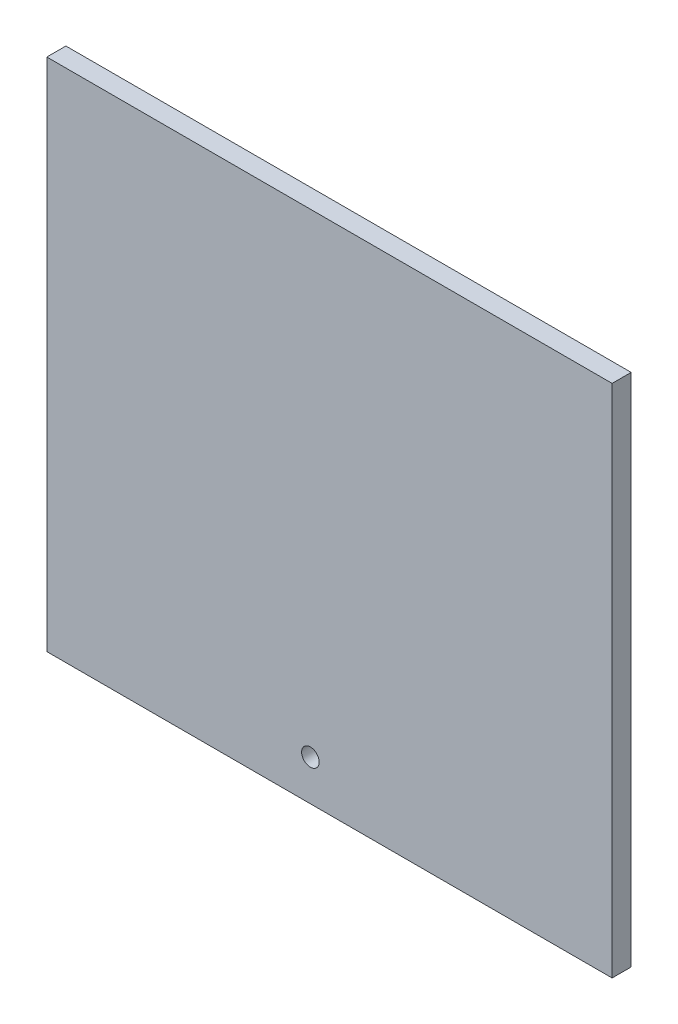
ISO-10303-21;
HEADER;
FILE_DESCRIPTION(('STEP AP214'),'2;1');
FILE_NAME('part.step','',(''),(''),'','','');
FILE_SCHEMA(('AUTOMOTIVE_DESIGN { 1 0 10303 214 1 1 1 1 }'));
ENDSEC;
DATA;
#1=APPLICATION_CONTEXT('core data for automotive mechanical design processes');
#2=APPLICATION_PROTOCOL_DEFINITION('international standard','automotive_design',2000,#1);
#3=PRODUCT_CONTEXT('',#1,'mechanical');
#4=PRODUCT('Part','Part','',(#3));
#5=PRODUCT_RELATED_PRODUCT_CATEGORY('part','',(#4));
#6=PRODUCT_DEFINITION_FORMATION('','',#4);
#7=PRODUCT_DEFINITION_CONTEXT('part definition',#1,'design');
#8=PRODUCT_DEFINITION('design','',#6,#7);
#9=PRODUCT_DEFINITION_SHAPE('','',#8);
#10=(LENGTH_UNIT() NAMED_UNIT(*) SI_UNIT(.MILLI.,.METRE.));
#11=(NAMED_UNIT(*) PLANE_ANGLE_UNIT() SI_UNIT($,.RADIAN.));
#12=(NAMED_UNIT(*) SI_UNIT($,.STERADIAN.) SOLID_ANGLE_UNIT());
#13=UNCERTAINTY_MEASURE_WITH_UNIT(LENGTH_MEASURE(1.E-05),#10,'distance_accuracy_value','');
#14=(GEOMETRIC_REPRESENTATION_CONTEXT(3) GLOBAL_UNCERTAINTY_ASSIGNED_CONTEXT((#13)) GLOBAL_UNIT_ASSIGNED_CONTEXT((#10,
#11,#12)) REPRESENTATION_CONTEXT('',''));
#15=CARTESIAN_POINT('',(0.,0.,0.));
#16=DIRECTION('',(0.,0.,1.));
#17=DIRECTION('',(1.,0.,0.));
#18=AXIS2_PLACEMENT_3D('',#15,#16,#17);
#19=CARTESIAN_POINT('',(94.107,85.725,6.35));
#20=DIRECTION('',(-1.,0.,0.));
#21=DIRECTION('',(0.,-1.,0.));
#22=AXIS2_PLACEMENT_3D('',#19,#20,#21);
#23=PLANE('',#22);
#24=DIRECTION('',(0.,1.,0.));
#25=VECTOR('',#24,1.);
#26=CARTESIAN_POINT('',(94.107,85.725,0.));
#27=LINE('',#26,#25);
#28=CARTESIAN_POINT('',(94.107,-85.725,0.));
#29=VERTEX_POINT('',#28);
#30=CARTESIAN_POINT('',(94.107,85.725,0.));
#31=VERTEX_POINT('',#30);
#32=EDGE_CURVE('E104',#29,#31,#27,.T.);
#33=ORIENTED_EDGE('',*,*,#32,.T.);
#34=DIRECTION('',(0.,0.,-1.));
#35=VECTOR('',#34,1.);
#36=CARTESIAN_POINT('',(94.107,85.725,6.35));
#37=LINE('',#36,#35);
#38=CARTESIAN_POINT('',(94.107,85.725,6.35));
#39=VERTEX_POINT('',#38);
#40=EDGE_CURVE('E11',#39,#31,#37,.T.);
#41=ORIENTED_EDGE('',*,*,#40,.F.);
#42=DIRECTION('',(0.,1.,0.));
#43=VECTOR('',#42,1.);
#44=CARTESIAN_POINT('',(94.107,85.725,6.35));
#45=LINE('',#44,#43);
#46=CARTESIAN_POINT('',(94.107,-85.725,6.35));
#47=VERTEX_POINT('',#46);
#48=EDGE_CURVE('E92',#47,#39,#45,.T.);
#49=ORIENTED_EDGE('',*,*,#48,.F.);
#50=DIRECTION('',(0.,0.,-1.));
#51=VECTOR('',#50,1.);
#52=CARTESIAN_POINT('',(94.107,-85.725,6.35));
#53=LINE('',#52,#51);
#54=EDGE_CURVE('E100',#47,#29,#53,.T.);
#55=ORIENTED_EDGE('',*,*,#54,.T.);
#56=EDGE_LOOP('',(#33,#41,#49,#55));
#57=FACE_BOUND('',#56,.T.);
#58=ADVANCED_FACE('F41',(#57),#23,.F.);
#59=CARTESIAN_POINT('',(-94.107,85.725,6.35));
#60=DIRECTION('',(0.,-1.,0.));
#61=DIRECTION('',(0.,0.,-1.));
#62=AXIS2_PLACEMENT_3D('',#59,#60,#61);
#63=PLANE('',#62);
#64=DIRECTION('',(-1.,0.,0.));
#65=VECTOR('',#64,1.);
#66=CARTESIAN_POINT('',(-94.107,85.725,0.));
#67=LINE('',#66,#65);
#68=CARTESIAN_POINT('',(-94.107,85.725,0.));
#69=VERTEX_POINT('',#68);
#70=EDGE_CURVE('E96',#31,#69,#67,.T.);
#71=ORIENTED_EDGE('',*,*,#70,.T.);
#72=DIRECTION('',(0.,0.,-1.));
#73=VECTOR('',#72,1.);
#74=CARTESIAN_POINT('',(-94.107,85.725,6.35));
#75=LINE('',#74,#73);
#76=CARTESIAN_POINT('',(-94.107,85.725,6.35));
#77=VERTEX_POINT('',#76);
#78=EDGE_CURVE('E49',#77,#69,#75,.T.);
#79=ORIENTED_EDGE('',*,*,#78,.F.);
#80=DIRECTION('',(-1.,0.,0.));
#81=VECTOR('',#80,1.);
#82=CARTESIAN_POINT('',(-94.107,85.725,6.35));
#83=LINE('',#82,#81);
#84=EDGE_CURVE('E87',#39,#77,#83,.T.);
#85=ORIENTED_EDGE('',*,*,#84,.F.);
#86=ORIENTED_EDGE('',*,*,#40,.T.);
#87=EDGE_LOOP('',(#71,#79,#85,#86));
#88=FACE_BOUND('',#87,.T.);
#89=ADVANCED_FACE('F95',(#88),#63,.F.);
#90=CARTESIAN_POINT('',(-94.107,85.725,6.35));
#91=DIRECTION('',(1.,0.,0.));
#92=DIRECTION('',(0.,1.,0.));
#93=AXIS2_PLACEMENT_3D('',#90,#91,#92);
#94=PLANE('',#93);
#95=DIRECTION('',(0.,-1.,0.));
#96=VECTOR('',#95,1.);
#97=CARTESIAN_POINT('',(-94.107,85.725,0.));
#98=LINE('',#97,#96);
#99=CARTESIAN_POINT('',(-94.107,-85.725,0.));
#100=VERTEX_POINT('',#99);
#101=EDGE_CURVE('E74',#69,#100,#98,.T.);
#102=ORIENTED_EDGE('',*,*,#101,.T.);
#103=DIRECTION('',(0.,0.,-1.));
#104=VECTOR('',#103,1.);
#105=CARTESIAN_POINT('',(-94.107,-85.725,6.35));
#106=LINE('',#105,#104);
#107=CARTESIAN_POINT('',(-94.107,-85.725,6.35));
#108=VERTEX_POINT('',#107);
#109=EDGE_CURVE('E97',#108,#100,#106,.T.);
#110=ORIENTED_EDGE('',*,*,#109,.F.);
#111=DIRECTION('',(0.,-1.,0.));
#112=VECTOR('',#111,1.);
#113=CARTESIAN_POINT('',(-94.107,85.725,6.35));
#114=LINE('',#113,#112);
#115=EDGE_CURVE('E90',#77,#108,#114,.T.);
#116=ORIENTED_EDGE('',*,*,#115,.F.);
#117=ORIENTED_EDGE('',*,*,#78,.T.);
#118=EDGE_LOOP('',(#102,#110,#116,#117));
#119=FACE_BOUND('',#118,.T.);
#120=ADVANCED_FACE('F98',(#119),#94,.F.);
#121=CARTESIAN_POINT('',(-94.107,-85.725,6.35));
#122=DIRECTION('',(0.,1.,0.));
#123=DIRECTION('',(0.,0.,1.));
#124=AXIS2_PLACEMENT_3D('',#121,#122,#123);
#125=PLANE('',#124);
#126=DIRECTION('',(1.,0.,0.));
#127=VECTOR('',#126,1.);
#128=CARTESIAN_POINT('',(-94.107,-85.725,0.));
#129=LINE('',#128,#127);
#130=EDGE_CURVE('E80',#100,#29,#129,.T.);
#131=ORIENTED_EDGE('',*,*,#130,.T.);
#132=ORIENTED_EDGE('',*,*,#54,.F.);
#133=DIRECTION('',(1.,0.,0.));
#134=VECTOR('',#133,1.);
#135=CARTESIAN_POINT('',(-94.107,-85.725,6.35));
#136=LINE('',#135,#134);
#137=EDGE_CURVE('E57',#108,#47,#136,.T.);
#138=ORIENTED_EDGE('',*,*,#137,.F.);
#139=ORIENTED_EDGE('',*,*,#109,.T.);
#140=EDGE_LOOP('',(#131,#132,#138,#139));
#141=FACE_BOUND('',#140,.T.);
#142=ADVANCED_FACE('F112',(#141),#125,.F.);
#143=CARTESIAN_POINT('',(0.,0.,6.35));
#144=DIRECTION('',(0.,0.,1.));
#145=DIRECTION('',(1.,0.,0.));
#146=AXIS2_PLACEMENT_3D('',#143,#144,#145);
#147=PLANE('',#146);
#148=CARTESIAN_POINT('',(-6.35,-72.263,6.35));
#149=DIRECTION('',(0.,0.,1.));
#150=DIRECTION('',(1.,0.,0.));
#151=AXIS2_PLACEMENT_3D('',#148,#149,#150);
#152=CIRCLE('',#151,2.921);
#153=CARTESIAN_POINT('',(-3.429,-72.263,6.35));
#154=VERTEX_POINT('',#153);
#155=EDGE_CURVE('E118',#154,#154,#152,.T.);
#156=ORIENTED_EDGE('',*,*,#155,.F.);
#157=EDGE_LOOP('',(#156));
#158=FACE_BOUND('',#157,.T.);
#159=ORIENTED_EDGE('',*,*,#48,.T.);
#160=ORIENTED_EDGE('',*,*,#84,.T.);
#161=ORIENTED_EDGE('',*,*,#115,.T.);
#162=ORIENTED_EDGE('',*,*,#137,.T.);
#163=EDGE_LOOP('',(#159,#160,#161,#162));
#164=FACE_BOUND('',#163,.T.);
#165=ADVANCED_FACE('F88',(#158,#164),#147,.T.);
#166=CARTESIAN_POINT('',(0.,0.,0.));
#167=DIRECTION('',(0.,0.,1.));
#168=DIRECTION('',(1.,0.,0.));
#169=AXIS2_PLACEMENT_3D('',#166,#167,#168);
#170=PLANE('',#169);
#171=CARTESIAN_POINT('',(-6.35,-72.263,0.));
#172=DIRECTION('',(0.,0.,1.));
#173=DIRECTION('',(1.,0.,0.));
#174=AXIS2_PLACEMENT_3D('',#171,#172,#173);
#175=CIRCLE('',#174,2.921);
#176=CARTESIAN_POINT('',(-3.429,-72.263,0.));
#177=VERTEX_POINT('',#176);
#178=EDGE_CURVE('E107',#177,#177,#175,.T.);
#179=ORIENTED_EDGE('',*,*,#178,.T.);
#180=EDGE_LOOP('',(#179));
#181=FACE_BOUND('',#180,.T.);
#182=ORIENTED_EDGE('',*,*,#32,.F.);
#183=ORIENTED_EDGE('',*,*,#130,.F.);
#184=ORIENTED_EDGE('',*,*,#101,.F.);
#185=ORIENTED_EDGE('',*,*,#70,.F.);
#186=EDGE_LOOP('',(#182,#183,#184,#185));
#187=FACE_BOUND('',#186,.T.);
#188=ADVANCED_FACE('F115',(#181,#187),#170,.F.);
#189=CARTESIAN_POINT('',(-6.35,-72.263,0.));
#190=DIRECTION('',(0.,0.,1.));
#191=DIRECTION('',(1.,0.,0.));
#192=AXIS2_PLACEMENT_3D('',#189,#190,#191);
#193=CYLINDRICAL_SURFACE('',#192,2.921);
#194=ORIENTED_EDGE('',*,*,#178,.F.);
#195=EDGE_LOOP('',(#194));
#196=FACE_BOUND('',#195,.T.);
#197=ORIENTED_EDGE('',*,*,#155,.T.);
#198=EDGE_LOOP('',(#197));
#199=FACE_BOUND('',#198,.T.);
#200=ADVANCED_FACE('F125',(#196,#199),#193,.F.);
#201=CLOSED_SHELL('',(#58,#89,#120,#142,#165,#188,#200));
#202=MANIFOLD_SOLID_BREP('B2',#201);
#203=ADVANCED_BREP_SHAPE_REPRESENTATION('',(#18,#202),#14);
#204=SHAPE_DEFINITION_REPRESENTATION(#9,#203);
ENDSEC;
END-ISO-10303-21;
